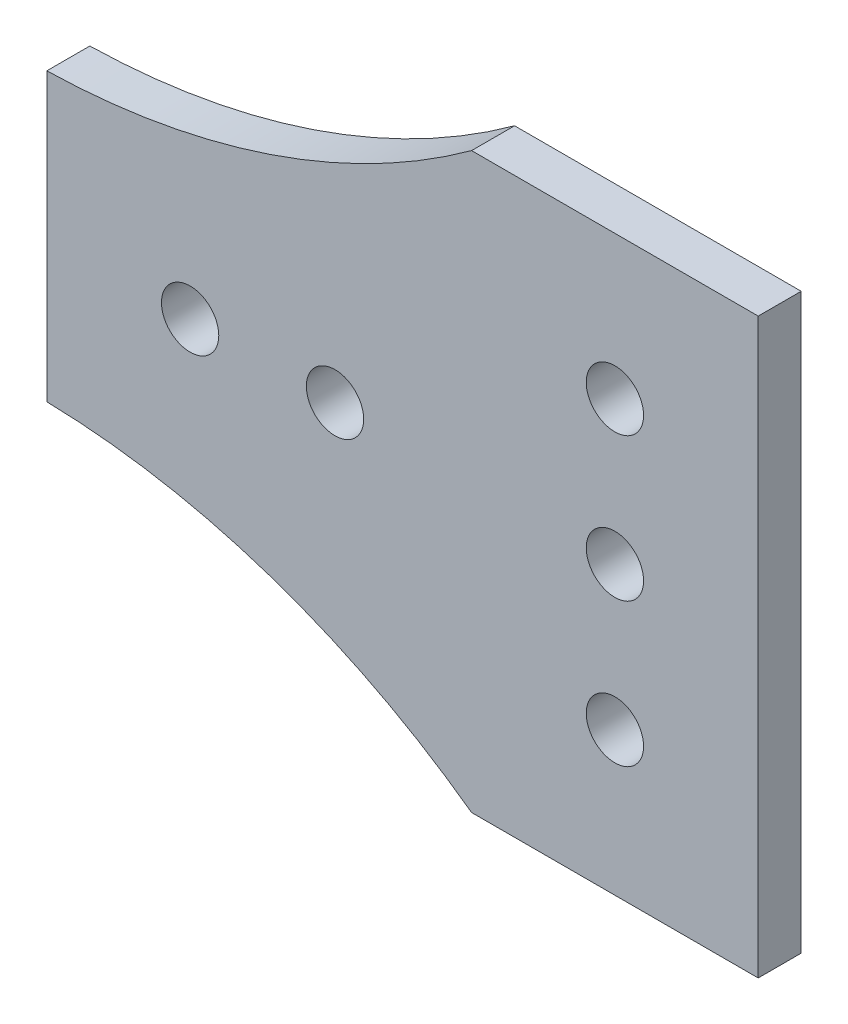
ISO-10303-21;
HEADER;
FILE_DESCRIPTION(('STEP AP214'),'2;1');
FILE_NAME('part.step','',(''),(''),'','','');
FILE_SCHEMA(('AUTOMOTIVE_DESIGN { 1 0 10303 214 1 1 1 1 }'));
ENDSEC;
DATA;
#1=APPLICATION_CONTEXT('core data for automotive mechanical design processes');
#2=APPLICATION_PROTOCOL_DEFINITION('international standard','automotive_design',2000,#1);
#3=PRODUCT_CONTEXT('',#1,'mechanical');
#4=PRODUCT('Part','Part','',(#3));
#5=PRODUCT_RELATED_PRODUCT_CATEGORY('part','',(#4));
#6=PRODUCT_DEFINITION_FORMATION('','',#4);
#7=PRODUCT_DEFINITION_CONTEXT('part definition',#1,'design');
#8=PRODUCT_DEFINITION('design','',#6,#7);
#9=PRODUCT_DEFINITION_SHAPE('','',#8);
#10=(LENGTH_UNIT() NAMED_UNIT(*) SI_UNIT(.MILLI.,.METRE.));
#11=(NAMED_UNIT(*) PLANE_ANGLE_UNIT() SI_UNIT($,.RADIAN.));
#12=(NAMED_UNIT(*) SI_UNIT($,.STERADIAN.) SOLID_ANGLE_UNIT());
#13=UNCERTAINTY_MEASURE_WITH_UNIT(LENGTH_MEASURE(1.E-05),#10,'distance_accuracy_value','');
#14=(GEOMETRIC_REPRESENTATION_CONTEXT(3) GLOBAL_UNCERTAINTY_ASSIGNED_CONTEXT((#13)) GLOBAL_UNIT_ASSIGNED_CONTEXT((#10,
#11,#12)) REPRESENTATION_CONTEXT('',''));
#15=CARTESIAN_POINT('',(0.,0.,0.));
#16=DIRECTION('',(0.,0.,1.));
#17=DIRECTION('',(1.,0.,0.));
#18=AXIS2_PLACEMENT_3D('',#15,#16,#17);
#19=CARTESIAN_POINT('',(-28.519267245959,52.4132721540115,3.));
#20=DIRECTION('',(0.,0.,1.));
#21=DIRECTION('',(1.,0.,0.));
#22=AXIS2_PLACEMENT_3D('',#19,#20,#21);
#23=PLANE('',#22);
#24=CARTESIAN_POINT('',(12.2988880532264,-0.00537981955767153,3.));
#25=DIRECTION('',(0.,0.,1.));
#26=DIRECTION('',(1.,0.,0.));
#27=AXIS2_PLACEMENT_3D('',#24,#25,#26);
#28=CIRCLE('',#27,2.00000000000002);
#29=CARTESIAN_POINT('',(14.2988880532265,-0.00537981955767153,3.));
#30=VERTEX_POINT('',#29);
#31=EDGE_CURVE('E222',#30,#30,#28,.T.);
#32=ORIENTED_EDGE('',*,*,#31,.F.);
#33=EDGE_LOOP('',(#32));
#34=FACE_BOUND('',#33,.T.);
#35=CARTESIAN_POINT('',(-7.23164246692409,-10.0053798195586,3.));
#36=DIRECTION('',(0.,0.,1.));
#37=DIRECTION('',(1.,0.,0.));
#38=AXIS2_PLACEMENT_3D('',#35,#36,#37);
#39=CIRCLE('',#38,1.99999999999997);
#40=CARTESIAN_POINT('',(-5.23164246692412,-10.0053798195586,3.));
#41=VERTEX_POINT('',#40);
#42=EDGE_CURVE('E238',#41,#41,#39,.T.);
#43=ORIENTED_EDGE('',*,*,#42,.F.);
#44=EDGE_LOOP('',(#43));
#45=FACE_BOUND('',#44,.T.);
#46=CARTESIAN_POINT('',(-28.519267245959,52.4132721540115,3.));
#47=DIRECTION('',(0.,0.,-1.));
#48=DIRECTION('',(1.,0.,0.));
#49=AXIS2_PLACEMENT_3D('',#46,#47,#48);
#50=CIRCLE('',#49,52.4318675168022);
#51=CARTESIAN_POINT('',(2.2988880532262,9.99462018044234,3.));
#52=VERTEX_POINT('',#51);
#53=CARTESIAN_POINT('',(-27.3421280981509,-0.00537981955800459,3.));
#54=VERTEX_POINT('',#53);
#55=EDGE_CURVE('E152',#52,#54,#50,.T.);
#56=ORIENTED_EDGE('',*,*,#55,.T.);
#57=DIRECTION('',(0.,-1.,0.));
#58=VECTOR('',#57,1.);
#59=CARTESIAN_POINT('',(-27.3421280981509,-0.00537981955800459,3.));
#60=LINE('',#59,#58);
#61=CARTESIAN_POINT('',(-27.3421280981509,-20.0053798195578,3.));
#62=VERTEX_POINT('',#61);
#63=EDGE_CURVE('E100',#54,#62,#60,.T.);
#64=ORIENTED_EDGE('',*,*,#63,.T.);
#65=CARTESIAN_POINT('',(-28.5192672459588,-72.4240317931273,3.));
#66=DIRECTION('',(0.,0.,-1.));
#67=DIRECTION('',(1.,0.,0.));
#68=AXIS2_PLACEMENT_3D('',#65,#66,#67);
#69=CIRCLE('',#68,52.4318675168024);
#70=CARTESIAN_POINT('',(2.29888805322633,-30.0053798195577,3.));
#71=VERTEX_POINT('',#70);
#72=EDGE_CURVE('E113',#62,#71,#69,.T.);
#73=ORIENTED_EDGE('',*,*,#72,.T.);
#74=DIRECTION('',(1.,0.,0.));
#75=VECTOR('',#74,1.);
#76=CARTESIAN_POINT('',(2.29888805322637,-30.0053798195576,3.));
#77=LINE('',#76,#75);
#78=CARTESIAN_POINT('',(22.2988880532266,-30.0053798195574,3.));
#79=VERTEX_POINT('',#78);
#80=EDGE_CURVE('E107',#71,#79,#77,.T.);
#81=ORIENTED_EDGE('',*,*,#80,.T.);
#82=DIRECTION('',(0.,1.,0.));
#83=VECTOR('',#82,1.);
#84=CARTESIAN_POINT('',(22.2988880532266,-30.0053798195574,3.));
#85=LINE('',#84,#83);
#86=CARTESIAN_POINT('',(22.2988880532266,9.99462018044212,3.));
#87=VERTEX_POINT('',#86);
#88=EDGE_CURVE('E111',#79,#87,#85,.T.);
#89=ORIENTED_EDGE('',*,*,#88,.T.);
#90=DIRECTION('',(-1.,0.,0.));
#91=VECTOR('',#90,1.);
#92=CARTESIAN_POINT('',(22.2988880532266,9.99462018044212,3.));
#93=LINE('',#92,#91);
#94=EDGE_CURVE('E63',#87,#52,#93,.T.);
#95=ORIENTED_EDGE('',*,*,#94,.T.);
#96=EDGE_LOOP('',(#56,#64,#73,#81,#89,#95));
#97=FACE_BOUND('',#96,.T.);
#98=CARTESIAN_POINT('',(-17.3421280981507,-10.005379819558,3.));
#99=DIRECTION('',(0.,0.,1.));
#100=DIRECTION('',(1.,0.,0.));
#101=AXIS2_PLACEMENT_3D('',#98,#99,#100);
#102=CIRCLE('',#101,2.00000000000002);
#103=CARTESIAN_POINT('',(-15.3421280981506,-10.005379819558,3.));
#104=VERTEX_POINT('',#103);
#105=EDGE_CURVE('E140',#104,#104,#102,.T.);
#106=ORIENTED_EDGE('',*,*,#105,.F.);
#107=EDGE_LOOP('',(#106));
#108=FACE_BOUND('',#107,.T.);
#109=CARTESIAN_POINT('',(12.2988880532265,-10.0053798195577,3.));
#110=DIRECTION('',(0.,0.,1.));
#111=DIRECTION('',(1.,0.,0.));
#112=AXIS2_PLACEMENT_3D('',#109,#110,#111);
#113=CIRCLE('',#112,2.);
#114=CARTESIAN_POINT('',(14.2988880532265,-10.0053798195577,3.));
#115=VERTEX_POINT('',#114);
#116=EDGE_CURVE('E230',#115,#115,#113,.T.);
#117=ORIENTED_EDGE('',*,*,#116,.F.);
#118=EDGE_LOOP('',(#117));
#119=FACE_BOUND('',#118,.T.);
#120=CARTESIAN_POINT('',(12.2988880532265,-20.0053798195577,3.));
#121=DIRECTION('',(0.,0.,1.));
#122=DIRECTION('',(1.,0.,0.));
#123=AXIS2_PLACEMENT_3D('',#120,#121,#122);
#124=CIRCLE('',#123,2.);
#125=CARTESIAN_POINT('',(14.2988880532265,-20.0053798195577,3.));
#126=VERTEX_POINT('',#125);
#127=EDGE_CURVE('E211',#126,#126,#124,.T.);
#128=ORIENTED_EDGE('',*,*,#127,.F.);
#129=EDGE_LOOP('',(#128));
#130=FACE_BOUND('',#129,.T.);
#131=ADVANCED_FACE('F45',(#34,#45,#97,#108,#119,#130),#23,.T.);
#132=CARTESIAN_POINT('',(-28.519267245959,52.4132721540115,0.));
#133=DIRECTION('',(0.,0.,1.));
#134=DIRECTION('',(1.,0.,0.));
#135=AXIS2_PLACEMENT_3D('',#132,#133,#134);
#136=PLANE('',#135);
#137=CARTESIAN_POINT('',(-28.519267245959,52.4132721540115,0.));
#138=DIRECTION('',(0.,0.,-1.));
#139=DIRECTION('',(1.,0.,0.));
#140=AXIS2_PLACEMENT_3D('',#137,#138,#139);
#141=CIRCLE('',#140,52.4318675168022);
#142=CARTESIAN_POINT('',(2.2988880532262,9.99462018044234,0.));
#143=VERTEX_POINT('',#142);
#144=CARTESIAN_POINT('',(-27.3421280981509,-0.00537981955800459,0.));
#145=VERTEX_POINT('',#144);
#146=EDGE_CURVE('E135',#143,#145,#141,.T.);
#147=ORIENTED_EDGE('',*,*,#146,.F.);
#148=DIRECTION('',(-1.,0.,0.));
#149=VECTOR('',#148,1.);
#150=CARTESIAN_POINT('',(22.2988880532266,9.99462018044212,0.));
#151=LINE('',#150,#149);
#152=CARTESIAN_POINT('',(22.2988880532266,9.99462018044212,0.));
#153=VERTEX_POINT('',#152);
#154=EDGE_CURVE('E92',#153,#143,#151,.T.);
#155=ORIENTED_EDGE('',*,*,#154,.F.);
#156=DIRECTION('',(0.,1.,0.));
#157=VECTOR('',#156,1.);
#158=CARTESIAN_POINT('',(22.2988880532266,-30.0053798195574,0.));
#159=LINE('',#158,#157);
#160=CARTESIAN_POINT('',(22.2988880532266,-30.0053798195574,0.));
#161=VERTEX_POINT('',#160);
#162=EDGE_CURVE('E86',#161,#153,#159,.T.);
#163=ORIENTED_EDGE('',*,*,#162,.F.);
#164=DIRECTION('',(1.,0.,0.));
#165=VECTOR('',#164,1.);
#166=CARTESIAN_POINT('',(2.29888805322637,-30.0053798195576,0.));
#167=LINE('',#166,#165);
#168=CARTESIAN_POINT('',(2.29888805322633,-30.0053798195577,0.));
#169=VERTEX_POINT('',#168);
#170=EDGE_CURVE('E122',#169,#161,#167,.T.);
#171=ORIENTED_EDGE('',*,*,#170,.F.);
#172=CARTESIAN_POINT('',(-28.5192672459588,-72.4240317931273,0.));
#173=DIRECTION('',(0.,0.,-1.));
#174=DIRECTION('',(1.,0.,0.));
#175=AXIS2_PLACEMENT_3D('',#172,#173,#174);
#176=CIRCLE('',#175,52.4318675168024);
#177=CARTESIAN_POINT('',(-27.3421280981509,-20.0053798195578,0.));
#178=VERTEX_POINT('',#177);
#179=EDGE_CURVE('E143',#178,#169,#176,.T.);
#180=ORIENTED_EDGE('',*,*,#179,.F.);
#181=DIRECTION('',(0.,-1.,0.));
#182=VECTOR('',#181,1.);
#183=CARTESIAN_POINT('',(-27.3421280981509,-0.00537981955800459,0.));
#184=LINE('',#183,#182);
#185=EDGE_CURVE('E139',#145,#178,#184,.T.);
#186=ORIENTED_EDGE('',*,*,#185,.F.);
#187=EDGE_LOOP('',(#147,#155,#163,#171,#180,#186));
#188=FACE_BOUND('',#187,.T.);
#189=CARTESIAN_POINT('',(-17.3421280981507,-10.005379819558,0.));
#190=DIRECTION('',(0.,0.,1.));
#191=DIRECTION('',(1.,0.,0.));
#192=AXIS2_PLACEMENT_3D('',#189,#190,#191);
#193=CIRCLE('',#192,2.00000000000002);
#194=CARTESIAN_POINT('',(-15.3421280981506,-10.005379819558,0.));
#195=VERTEX_POINT('',#194);
#196=EDGE_CURVE('E242',#195,#195,#193,.T.);
#197=ORIENTED_EDGE('',*,*,#196,.T.);
#198=EDGE_LOOP('',(#197));
#199=FACE_BOUND('',#198,.T.);
#200=CARTESIAN_POINT('',(-7.23164246692409,-10.0053798195586,0.));
#201=DIRECTION('',(0.,0.,1.));
#202=DIRECTION('',(1.,0.,0.));
#203=AXIS2_PLACEMENT_3D('',#200,#201,#202);
#204=CIRCLE('',#203,1.99999999999997);
#205=CARTESIAN_POINT('',(-5.23164246692412,-10.0053798195586,0.));
#206=VERTEX_POINT('',#205);
#207=EDGE_CURVE('E234',#206,#206,#204,.T.);
#208=ORIENTED_EDGE('',*,*,#207,.T.);
#209=EDGE_LOOP('',(#208));
#210=FACE_BOUND('',#209,.T.);
#211=CARTESIAN_POINT('',(12.2988880532265,-10.0053798195577,0.));
#212=DIRECTION('',(0.,0.,1.));
#213=DIRECTION('',(1.,0.,0.));
#214=AXIS2_PLACEMENT_3D('',#211,#212,#213);
#215=CIRCLE('',#214,2.);
#216=CARTESIAN_POINT('',(14.2988880532265,-10.0053798195577,0.));
#217=VERTEX_POINT('',#216);
#218=EDGE_CURVE('E226',#217,#217,#215,.T.);
#219=ORIENTED_EDGE('',*,*,#218,.T.);
#220=EDGE_LOOP('',(#219));
#221=FACE_BOUND('',#220,.T.);
#222=CARTESIAN_POINT('',(12.2988880532264,-0.00537981955767153,0.));
#223=DIRECTION('',(0.,0.,1.));
#224=DIRECTION('',(1.,0.,0.));
#225=AXIS2_PLACEMENT_3D('',#222,#223,#224);
#226=CIRCLE('',#225,2.00000000000002);
#227=CARTESIAN_POINT('',(14.2988880532265,-0.00537981955767153,0.));
#228=VERTEX_POINT('',#227);
#229=EDGE_CURVE('E219',#228,#228,#226,.T.);
#230=ORIENTED_EDGE('',*,*,#229,.T.);
#231=EDGE_LOOP('',(#230));
#232=FACE_BOUND('',#231,.T.);
#233=CARTESIAN_POINT('',(12.2988880532265,-20.0053798195577,0.));
#234=DIRECTION('',(0.,0.,1.));
#235=DIRECTION('',(1.,0.,0.));
#236=AXIS2_PLACEMENT_3D('',#233,#234,#235);
#237=CIRCLE('',#236,2.);
#238=CARTESIAN_POINT('',(14.2988880532265,-20.0053798195577,0.));
#239=VERTEX_POINT('',#238);
#240=EDGE_CURVE('E214',#239,#239,#237,.T.);
#241=ORIENTED_EDGE('',*,*,#240,.T.);
#242=EDGE_LOOP('',(#241));
#243=FACE_BOUND('',#242,.T.);
#244=ADVANCED_FACE('F165',(#188,#199,#210,#221,#232,#243),#136,.F.);
#245=CARTESIAN_POINT('',(-28.519267245959,52.4132721540115,3.));
#246=DIRECTION('',(0.,0.,-1.));
#247=DIRECTION('',(-1.,0.,0.));
#248=AXIS2_PLACEMENT_3D('',#245,#246,#247);
#249=CYLINDRICAL_SURFACE('',#248,52.4318675168022);
#250=ORIENTED_EDGE('',*,*,#146,.T.);
#251=DIRECTION('',(0.,0.,-1.));
#252=VECTOR('',#251,1.);
#253=CARTESIAN_POINT('',(-27.3421280981509,-0.00537981955800459,3.));
#254=LINE('',#253,#252);
#255=EDGE_CURVE('E11',#54,#145,#254,.T.);
#256=ORIENTED_EDGE('',*,*,#255,.F.);
#257=ORIENTED_EDGE('',*,*,#55,.F.);
#258=DIRECTION('',(0.,0.,-1.));
#259=VECTOR('',#258,1.);
#260=CARTESIAN_POINT('',(2.2988880532262,9.99462018044234,3.));
#261=LINE('',#260,#259);
#262=EDGE_CURVE('E131',#52,#143,#261,.T.);
#263=ORIENTED_EDGE('',*,*,#262,.T.);
#264=EDGE_LOOP('',(#250,#256,#257,#263));
#265=FACE_BOUND('',#264,.T.);
#266=ADVANCED_FACE('F47',(#265),#249,.F.);
#267=CARTESIAN_POINT('',(-27.3421280981509,-0.00537981955800459,3.));
#268=DIRECTION('',(1.,0.,0.));
#269=DIRECTION('',(0.,0.,-1.));
#270=AXIS2_PLACEMENT_3D('',#267,#268,#269);
#271=PLANE('',#270);
#272=ORIENTED_EDGE('',*,*,#185,.T.);
#273=DIRECTION('',(0.,0.,-1.));
#274=VECTOR('',#273,1.);
#275=CARTESIAN_POINT('',(-27.3421280981509,-20.0053798195578,3.));
#276=LINE('',#275,#274);
#277=EDGE_CURVE('E55',#62,#178,#276,.T.);
#278=ORIENTED_EDGE('',*,*,#277,.F.);
#279=ORIENTED_EDGE('',*,*,#63,.F.);
#280=ORIENTED_EDGE('',*,*,#255,.T.);
#281=EDGE_LOOP('',(#272,#278,#279,#280));
#282=FACE_BOUND('',#281,.T.);
#283=ADVANCED_FACE('F320',(#282),#271,.F.);
#284=CARTESIAN_POINT('',(-28.5192672459588,-72.4240317931273,3.));
#285=DIRECTION('',(0.,0.,-1.));
#286=DIRECTION('',(-1.,0.,0.));
#287=AXIS2_PLACEMENT_3D('',#284,#285,#286);
#288=CYLINDRICAL_SURFACE('',#287,52.4318675168024);
#289=ORIENTED_EDGE('',*,*,#179,.T.);
#290=DIRECTION('',(0.,0.,-1.));
#291=VECTOR('',#290,1.);
#292=CARTESIAN_POINT('',(2.29888805322633,-30.0053798195577,3.));
#293=LINE('',#292,#291);
#294=EDGE_CURVE('E124',#71,#169,#293,.T.);
#295=ORIENTED_EDGE('',*,*,#294,.F.);
#296=ORIENTED_EDGE('',*,*,#72,.F.);
#297=ORIENTED_EDGE('',*,*,#277,.T.);
#298=EDGE_LOOP('',(#289,#295,#296,#297));
#299=FACE_BOUND('',#298,.T.);
#300=ADVANCED_FACE('F162',(#299),#288,.F.);
#301=CARTESIAN_POINT('',(2.29888805322637,-30.0053798195576,3.));
#302=DIRECTION('',(0.,1.,0.));
#303=DIRECTION('',(-1.,0.,0.));
#304=AXIS2_PLACEMENT_3D('',#301,#302,#303);
#305=PLANE('',#304);
#306=ORIENTED_EDGE('',*,*,#170,.T.);
#307=DIRECTION('',(0.,0.,-1.));
#308=VECTOR('',#307,1.);
#309=CARTESIAN_POINT('',(22.2988880532266,-30.0053798195574,3.));
#310=LINE('',#309,#308);
#311=EDGE_CURVE('E119',#79,#161,#310,.T.);
#312=ORIENTED_EDGE('',*,*,#311,.F.);
#313=ORIENTED_EDGE('',*,*,#80,.F.);
#314=ORIENTED_EDGE('',*,*,#294,.T.);
#315=EDGE_LOOP('',(#306,#312,#313,#314));
#316=FACE_BOUND('',#315,.T.);
#317=ADVANCED_FACE('F120',(#316),#305,.F.);
#318=CARTESIAN_POINT('',(22.2988880532266,-30.0053798195574,3.));
#319=DIRECTION('',(-1.,0.,0.));
#320=DIRECTION('',(0.,0.,1.));
#321=AXIS2_PLACEMENT_3D('',#318,#319,#320);
#322=PLANE('',#321);
#323=ORIENTED_EDGE('',*,*,#162,.T.);
#324=DIRECTION('',(0.,0.,-1.));
#325=VECTOR('',#324,1.);
#326=CARTESIAN_POINT('',(22.2988880532266,9.99462018044212,3.));
#327=LINE('',#326,#325);
#328=EDGE_CURVE('E125',#87,#153,#327,.T.);
#329=ORIENTED_EDGE('',*,*,#328,.F.);
#330=ORIENTED_EDGE('',*,*,#88,.F.);
#331=ORIENTED_EDGE('',*,*,#311,.T.);
#332=EDGE_LOOP('',(#323,#329,#330,#331));
#333=FACE_BOUND('',#332,.T.);
#334=ADVANCED_FACE('F127',(#333),#322,.F.);
#335=CARTESIAN_POINT('',(22.2988880532266,9.99462018044212,3.));
#336=DIRECTION('',(0.,-1.,0.));
#337=DIRECTION('',(1.,0.,0.));
#338=AXIS2_PLACEMENT_3D('',#335,#336,#337);
#339=PLANE('',#338);
#340=ORIENTED_EDGE('',*,*,#154,.T.);
#341=ORIENTED_EDGE('',*,*,#262,.F.);
#342=ORIENTED_EDGE('',*,*,#94,.F.);
#343=ORIENTED_EDGE('',*,*,#328,.T.);
#344=EDGE_LOOP('',(#340,#341,#342,#343));
#345=FACE_BOUND('',#344,.T.);
#346=ADVANCED_FACE('F170',(#345),#339,.F.);
#347=CARTESIAN_POINT('',(-17.3421280981507,-10.005379819558,3.));
#348=DIRECTION('',(0.,0.,-1.));
#349=DIRECTION('',(-1.,0.,0.));
#350=AXIS2_PLACEMENT_3D('',#347,#348,#349);
#351=CYLINDRICAL_SURFACE('',#350,2.00000000000002);
#352=ORIENTED_EDGE('',*,*,#105,.T.);
#353=EDGE_LOOP('',(#352));
#354=FACE_BOUND('',#353,.T.);
#355=ORIENTED_EDGE('',*,*,#196,.F.);
#356=EDGE_LOOP('',(#355));
#357=FACE_BOUND('',#356,.T.);
#358=ADVANCED_FACE('F172',(#354,#357),#351,.F.);
#359=CARTESIAN_POINT('',(-7.23164246692409,-10.0053798195586,3.));
#360=DIRECTION('',(0.,0.,-1.));
#361=DIRECTION('',(-1.,0.,0.));
#362=AXIS2_PLACEMENT_3D('',#359,#360,#361);
#363=CYLINDRICAL_SURFACE('',#362,1.99999999999997);
#364=ORIENTED_EDGE('',*,*,#42,.T.);
#365=EDGE_LOOP('',(#364));
#366=FACE_BOUND('',#365,.T.);
#367=ORIENTED_EDGE('',*,*,#207,.F.);
#368=EDGE_LOOP('',(#367));
#369=FACE_BOUND('',#368,.T.);
#370=ADVANCED_FACE('F178',(#366,#369),#363,.F.);
#371=CARTESIAN_POINT('',(12.2988880532265,-10.0053798195577,3.));
#372=DIRECTION('',(0.,0.,-1.));
#373=DIRECTION('',(-1.,0.,0.));
#374=AXIS2_PLACEMENT_3D('',#371,#372,#373);
#375=CYLINDRICAL_SURFACE('',#374,2.);
#376=ORIENTED_EDGE('',*,*,#116,.T.);
#377=EDGE_LOOP('',(#376));
#378=FACE_BOUND('',#377,.T.);
#379=ORIENTED_EDGE('',*,*,#218,.F.);
#380=EDGE_LOOP('',(#379));
#381=FACE_BOUND('',#380,.T.);
#382=ADVANCED_FACE('F194',(#378,#381),#375,.F.);
#383=CARTESIAN_POINT('',(12.2988880532264,-0.00537981955767153,3.));
#384=DIRECTION('',(0.,0.,-1.));
#385=DIRECTION('',(-1.,0.,0.));
#386=AXIS2_PLACEMENT_3D('',#383,#384,#385);
#387=CYLINDRICAL_SURFACE('',#386,2.00000000000002);
#388=ORIENTED_EDGE('',*,*,#31,.T.);
#389=EDGE_LOOP('',(#388));
#390=FACE_BOUND('',#389,.T.);
#391=ORIENTED_EDGE('',*,*,#229,.F.);
#392=EDGE_LOOP('',(#391));
#393=FACE_BOUND('',#392,.T.);
#394=ADVANCED_FACE('F198',(#390,#393),#387,.F.);
#395=CARTESIAN_POINT('',(12.2988880532265,-20.0053798195577,3.));
#396=DIRECTION('',(0.,0.,-1.));
#397=DIRECTION('',(-1.,0.,0.));
#398=AXIS2_PLACEMENT_3D('',#395,#396,#397);
#399=CYLINDRICAL_SURFACE('',#398,2.);
#400=ORIENTED_EDGE('',*,*,#127,.T.);
#401=EDGE_LOOP('',(#400));
#402=FACE_BOUND('',#401,.T.);
#403=ORIENTED_EDGE('',*,*,#240,.F.);
#404=EDGE_LOOP('',(#403));
#405=FACE_BOUND('',#404,.T.);
#406=ADVANCED_FACE('F202',(#402,#405),#399,.F.);
#407=CLOSED_SHELL('',(#131,#244,#266,#283,#300,#317,#334,#346,#358,#370,#382,#394,#406));
#408=MANIFOLD_SOLID_BREP('B2',#407);
#409=ADVANCED_BREP_SHAPE_REPRESENTATION('',(#18,#408),#14);
#410=SHAPE_DEFINITION_REPRESENTATION(#9,#409);
ENDSEC;
END-ISO-10303-21;
